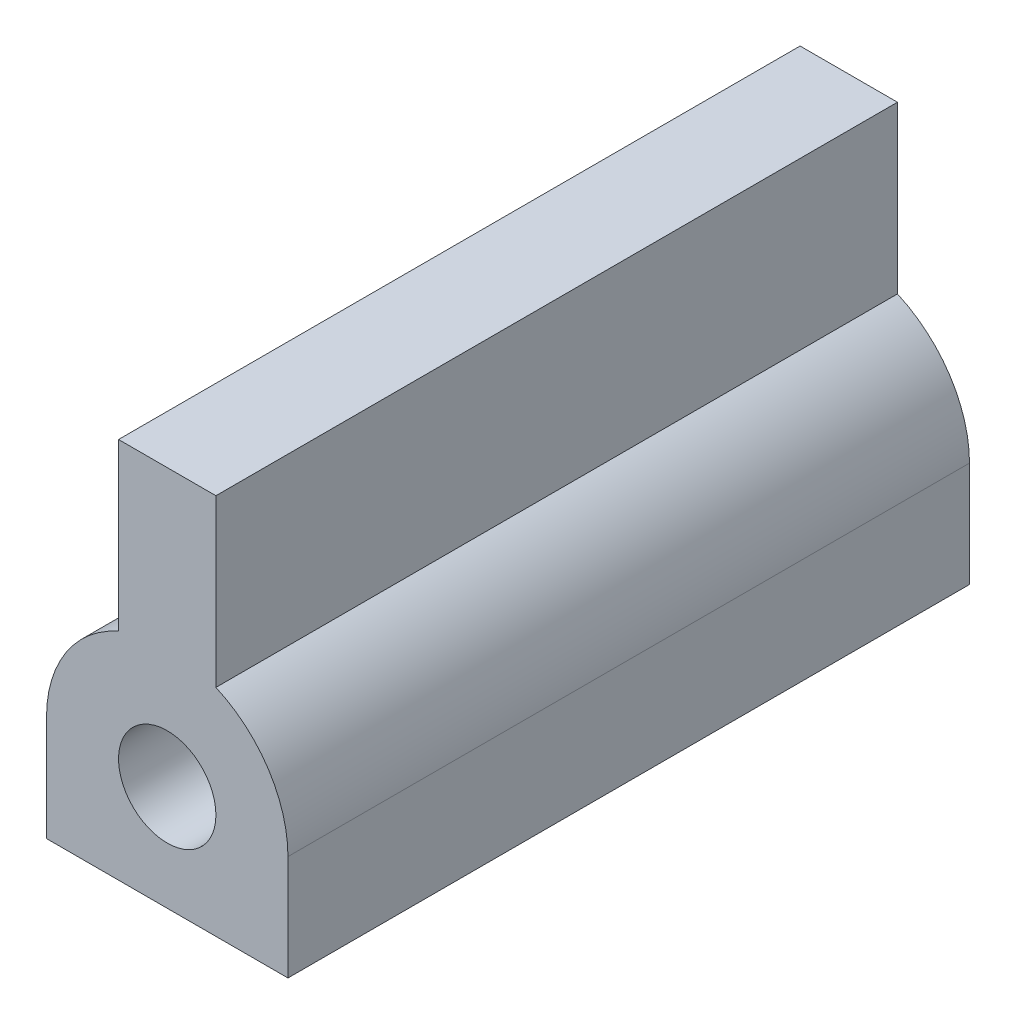
ISO-10303-21;
HEADER;
FILE_DESCRIPTION(('STEP AP214'),'2;1');
FILE_NAME('part.step','',(''),(''),'','','');
FILE_SCHEMA(('AUTOMOTIVE_DESIGN { 1 0 10303 214 1 1 1 1 }'));
ENDSEC;
DATA;
#1=APPLICATION_CONTEXT('core data for automotive mechanical design processes');
#2=APPLICATION_PROTOCOL_DEFINITION('international standard','automotive_design',2000,#1);
#3=PRODUCT_CONTEXT('',#1,'mechanical');
#4=PRODUCT('Part','Part','',(#3));
#5=PRODUCT_RELATED_PRODUCT_CATEGORY('part','',(#4));
#6=PRODUCT_DEFINITION_FORMATION('','',#4);
#7=PRODUCT_DEFINITION_CONTEXT('part definition',#1,'design');
#8=PRODUCT_DEFINITION('design','',#6,#7);
#9=PRODUCT_DEFINITION_SHAPE('','',#8);
#10=(LENGTH_UNIT() NAMED_UNIT(*) SI_UNIT(.MILLI.,.METRE.));
#11=(NAMED_UNIT(*) PLANE_ANGLE_UNIT() SI_UNIT($,.RADIAN.));
#12=(NAMED_UNIT(*) SI_UNIT($,.STERADIAN.) SOLID_ANGLE_UNIT());
#13=UNCERTAINTY_MEASURE_WITH_UNIT(LENGTH_MEASURE(1.E-05),#10,'distance_accuracy_value','');
#14=(GEOMETRIC_REPRESENTATION_CONTEXT(3) GLOBAL_UNCERTAINTY_ASSIGNED_CONTEXT((#13)) GLOBAL_UNIT_ASSIGNED_CONTEXT((#10,
#11,#12)) REPRESENTATION_CONTEXT('',''));
#15=CARTESIAN_POINT('',(0.,0.,0.));
#16=DIRECTION('',(0.,0.,1.));
#17=DIRECTION('',(1.,0.,0.));
#18=AXIS2_PLACEMENT_3D('',#15,#16,#17);
#19=CARTESIAN_POINT('',(0.,0.,22.225));
#20=DIRECTION('',(0.,0.,-1.));
#21=DIRECTION('',(-1.,0.,0.));
#22=AXIS2_PLACEMENT_3D('',#19,#20,#21);
#23=PLANE('',#22);
#24=DIRECTION('',(0.,-1.,0.));
#25=VECTOR('',#24,1.);
#26=CARTESIAN_POINT('',(-7.874,-6.858,22.225));
#27=LINE('',#26,#25);
#28=CARTESIAN_POINT('',(-7.874,0.,22.225));
#29=VERTEX_POINT('',#28);
#30=CARTESIAN_POINT('',(-7.874,-6.858,22.225));
#31=VERTEX_POINT('',#30);
#32=EDGE_CURVE('E164',#29,#31,#27,.T.);
#33=ORIENTED_EDGE('',*,*,#32,.T.);
#34=DIRECTION('',(1.,0.,0.));
#35=VECTOR('',#34,1.);
#36=CARTESIAN_POINT('',(7.874,-6.858,22.225));
#37=LINE('',#36,#35);
#38=CARTESIAN_POINT('',(7.874,-6.858,22.225));
#39=VERTEX_POINT('',#38);
#40=EDGE_CURVE('E100',#31,#39,#37,.T.);
#41=ORIENTED_EDGE('',*,*,#40,.T.);
#42=DIRECTION('',(0.,1.,0.));
#43=VECTOR('',#42,1.);
#44=CARTESIAN_POINT('',(7.874,0.,22.225));
#45=LINE('',#44,#43);
#46=CARTESIAN_POINT('',(7.874,0.,22.225));
#47=VERTEX_POINT('',#46);
#48=EDGE_CURVE('E185',#39,#47,#45,.T.);
#49=ORIENTED_EDGE('',*,*,#48,.T.);
#50=CARTESIAN_POINT('',(0.,0.,22.225));
#51=DIRECTION('',(0.,0.,1.));
#52=DIRECTION('',(-1.,0.,0.));
#53=AXIS2_PLACEMENT_3D('',#50,#51,#52);
#54=CIRCLE('',#53,7.874);
#55=CARTESIAN_POINT('',(3.175,7.20550143987217,22.225));
#56=VERTEX_POINT('',#55);
#57=EDGE_CURVE('E199',#47,#56,#54,.T.);
#58=ORIENTED_EDGE('',*,*,#57,.T.);
#59=DIRECTION('',(0.,1.,0.));
#60=VECTOR('',#59,1.);
#61=CARTESIAN_POINT('',(3.175,18.034,22.225));
#62=LINE('',#61,#60);
#63=CARTESIAN_POINT('',(3.175,18.034,22.225));
#64=VERTEX_POINT('',#63);
#65=EDGE_CURVE('E119',#56,#64,#62,.T.);
#66=ORIENTED_EDGE('',*,*,#65,.T.);
#67=DIRECTION('',(-1.,0.,0.));
#68=VECTOR('',#67,1.);
#69=CARTESIAN_POINT('',(-3.175,18.034,22.225));
#70=LINE('',#69,#68);
#71=CARTESIAN_POINT('',(-3.175,18.034,22.225));
#72=VERTEX_POINT('',#71);
#73=EDGE_CURVE('E113',#64,#72,#70,.T.);
#74=ORIENTED_EDGE('',*,*,#73,.T.);
#75=DIRECTION('',(0.,-1.,0.));
#76=VECTOR('',#75,1.);
#77=CARTESIAN_POINT('',(-3.175,7.20550143987217,22.225));
#78=LINE('',#77,#76);
#79=CARTESIAN_POINT('',(-3.175,7.20550143987217,22.225));
#80=VERTEX_POINT('',#79);
#81=EDGE_CURVE('E117',#72,#80,#78,.T.);
#82=ORIENTED_EDGE('',*,*,#81,.T.);
#83=CARTESIAN_POINT('',(0.,0.,22.225));
#84=DIRECTION('',(0.,0.,1.));
#85=DIRECTION('',(-1.,0.,0.));
#86=AXIS2_PLACEMENT_3D('',#83,#84,#85);
#87=CIRCLE('',#86,7.874);
#88=EDGE_CURVE('E57',#80,#29,#87,.T.);
#89=ORIENTED_EDGE('',*,*,#88,.T.);
#90=EDGE_LOOP('',(#33,#41,#49,#58,#66,#74,#82,#89));
#91=FACE_BOUND('',#90,.T.);
#92=CARTESIAN_POINT('',(0.,0.,22.225));
#93=DIRECTION('',(0.,0.,1.));
#94=DIRECTION('',(1.,0.,0.));
#95=AXIS2_PLACEMENT_3D('',#92,#93,#94);
#96=CIRCLE('',#95,3.175);
#97=CARTESIAN_POINT('',(3.175,0.,22.225));
#98=VERTEX_POINT('',#97);
#99=EDGE_CURVE('E146',#98,#98,#96,.T.);
#100=ORIENTED_EDGE('',*,*,#99,.F.);
#101=EDGE_LOOP('',(#100));
#102=FACE_BOUND('',#101,.T.);
#103=ADVANCED_FACE('F39',(#91,#102),#23,.F.);
#104=CARTESIAN_POINT('',(0.,0.,-22.225));
#105=DIRECTION('',(0.,0.,-1.));
#106=DIRECTION('',(-1.,0.,0.));
#107=AXIS2_PLACEMENT_3D('',#104,#105,#106);
#108=PLANE('',#107);
#109=DIRECTION('',(0.,-1.,0.));
#110=VECTOR('',#109,1.);
#111=CARTESIAN_POINT('',(-7.874,-6.858,-22.225));
#112=LINE('',#111,#110);
#113=CARTESIAN_POINT('',(-7.874,0.,-22.225));
#114=VERTEX_POINT('',#113);
#115=CARTESIAN_POINT('',(-7.874,-6.858,-22.225));
#116=VERTEX_POINT('',#115);
#117=EDGE_CURVE('E141',#114,#116,#112,.T.);
#118=ORIENTED_EDGE('',*,*,#117,.F.);
#119=CARTESIAN_POINT('',(0.,0.,-22.225));
#120=DIRECTION('',(0.,0.,1.));
#121=DIRECTION('',(-1.,0.,0.));
#122=AXIS2_PLACEMENT_3D('',#119,#120,#121);
#123=CIRCLE('',#122,7.874);
#124=CARTESIAN_POINT('',(-3.175,7.20550143987217,-22.225));
#125=VERTEX_POINT('',#124);
#126=EDGE_CURVE('E92',#125,#114,#123,.T.);
#127=ORIENTED_EDGE('',*,*,#126,.F.);
#128=DIRECTION('',(0.,-1.,0.));
#129=VECTOR('',#128,1.);
#130=CARTESIAN_POINT('',(-3.175,7.20550143987217,-22.225));
#131=LINE('',#130,#129);
#132=CARTESIAN_POINT('',(-3.175,18.034,-22.225));
#133=VERTEX_POINT('',#132);
#134=EDGE_CURVE('E86',#133,#125,#131,.T.);
#135=ORIENTED_EDGE('',*,*,#134,.F.);
#136=DIRECTION('',(-1.,0.,0.));
#137=VECTOR('',#136,1.);
#138=CARTESIAN_POINT('',(-3.175,18.034,-22.225));
#139=LINE('',#138,#137);
#140=CARTESIAN_POINT('',(3.175,18.034,-22.225));
#141=VERTEX_POINT('',#140);
#142=EDGE_CURVE('E128',#141,#133,#139,.T.);
#143=ORIENTED_EDGE('',*,*,#142,.F.);
#144=DIRECTION('',(0.,1.,0.));
#145=VECTOR('',#144,1.);
#146=CARTESIAN_POINT('',(3.175,18.034,-22.225));
#147=LINE('',#146,#145);
#148=CARTESIAN_POINT('',(3.175,7.20550143987217,-22.225));
#149=VERTEX_POINT('',#148);
#150=EDGE_CURVE('E155',#149,#141,#147,.T.);
#151=ORIENTED_EDGE('',*,*,#150,.F.);
#152=CARTESIAN_POINT('',(0.,0.,-22.225));
#153=DIRECTION('',(0.,0.,1.));
#154=DIRECTION('',(-1.,0.,0.));
#155=AXIS2_PLACEMENT_3D('',#152,#153,#154);
#156=CIRCLE('',#155,7.874);
#157=CARTESIAN_POINT('',(7.874,0.,-22.225));
#158=VERTEX_POINT('',#157);
#159=EDGE_CURVE('E152',#158,#149,#156,.T.);
#160=ORIENTED_EDGE('',*,*,#159,.F.);
#161=DIRECTION('',(0.,1.,0.));
#162=VECTOR('',#161,1.);
#163=CARTESIAN_POINT('',(7.874,0.,-22.225));
#164=LINE('',#163,#162);
#165=CARTESIAN_POINT('',(7.874,-6.858,-22.225));
#166=VERTEX_POINT('',#165);
#167=EDGE_CURVE('E149',#166,#158,#164,.T.);
#168=ORIENTED_EDGE('',*,*,#167,.F.);
#169=DIRECTION('',(1.,0.,0.));
#170=VECTOR('',#169,1.);
#171=CARTESIAN_POINT('',(7.874,-6.858,-22.225));
#172=LINE('',#171,#170);
#173=EDGE_CURVE('E145',#116,#166,#172,.T.);
#174=ORIENTED_EDGE('',*,*,#173,.F.);
#175=EDGE_LOOP('',(#118,#127,#135,#143,#151,#160,#168,#174));
#176=FACE_BOUND('',#175,.T.);
#177=CARTESIAN_POINT('',(0.,0.,-22.225));
#178=DIRECTION('',(0.,0.,1.));
#179=DIRECTION('',(1.,0.,0.));
#180=AXIS2_PLACEMENT_3D('',#177,#178,#179);
#181=CIRCLE('',#180,3.175);
#182=CARTESIAN_POINT('',(3.175,0.,-22.225));
#183=VERTEX_POINT('',#182);
#184=EDGE_CURVE('E209',#183,#183,#181,.T.);
#185=ORIENTED_EDGE('',*,*,#184,.T.);
#186=EDGE_LOOP('',(#185));
#187=FACE_BOUND('',#186,.T.);
#188=ADVANCED_FACE('F189',(#176,#187),#108,.T.);
#189=CARTESIAN_POINT('',(-7.874,-6.858,22.225));
#190=DIRECTION('',(1.,0.,0.));
#191=DIRECTION('',(0.,0.,-1.));
#192=AXIS2_PLACEMENT_3D('',#189,#190,#191);
#193=PLANE('',#192);
#194=ORIENTED_EDGE('',*,*,#117,.T.);
#195=DIRECTION('',(0.,0.,-1.));
#196=VECTOR('',#195,1.);
#197=CARTESIAN_POINT('',(-7.874,-6.858,22.225));
#198=LINE('',#197,#196);
#199=EDGE_CURVE('E11',#31,#116,#198,.T.);
#200=ORIENTED_EDGE('',*,*,#199,.F.);
#201=ORIENTED_EDGE('',*,*,#32,.F.);
#202=DIRECTION('',(0.,0.,-1.));
#203=VECTOR('',#202,1.);
#204=CARTESIAN_POINT('',(-7.874,0.,22.225));
#205=LINE('',#204,#203);
#206=EDGE_CURVE('E137',#29,#114,#205,.T.);
#207=ORIENTED_EDGE('',*,*,#206,.T.);
#208=EDGE_LOOP('',(#194,#200,#201,#207));
#209=FACE_BOUND('',#208,.T.);
#210=ADVANCED_FACE('F41',(#209),#193,.F.);
#211=CARTESIAN_POINT('',(7.874,-6.858,22.225));
#212=DIRECTION('',(0.,1.,0.));
#213=DIRECTION('',(-1.,0.,0.));
#214=AXIS2_PLACEMENT_3D('',#211,#212,#213);
#215=PLANE('',#214);
#216=ORIENTED_EDGE('',*,*,#173,.T.);
#217=DIRECTION('',(0.,0.,-1.));
#218=VECTOR('',#217,1.);
#219=CARTESIAN_POINT('',(7.874,-6.858,22.225));
#220=LINE('',#219,#218);
#221=EDGE_CURVE('E49',#39,#166,#220,.T.);
#222=ORIENTED_EDGE('',*,*,#221,.F.);
#223=ORIENTED_EDGE('',*,*,#40,.F.);
#224=ORIENTED_EDGE('',*,*,#199,.T.);
#225=EDGE_LOOP('',(#216,#222,#223,#224));
#226=FACE_BOUND('',#225,.T.);
#227=ADVANCED_FACE('F239',(#226),#215,.F.);
#228=CARTESIAN_POINT('',(7.874,0.,22.225));
#229=DIRECTION('',(-1.,0.,0.));
#230=DIRECTION('',(0.,0.,1.));
#231=AXIS2_PLACEMENT_3D('',#228,#229,#230);
#232=PLANE('',#231);
#233=ORIENTED_EDGE('',*,*,#167,.T.);
#234=DIRECTION('',(0.,0.,-1.));
#235=VECTOR('',#234,1.);
#236=CARTESIAN_POINT('',(7.874,0.,22.225));
#237=LINE('',#236,#235);
#238=EDGE_CURVE('E175',#47,#158,#237,.T.);
#239=ORIENTED_EDGE('',*,*,#238,.F.);
#240=ORIENTED_EDGE('',*,*,#48,.F.);
#241=ORIENTED_EDGE('',*,*,#221,.T.);
#242=EDGE_LOOP('',(#233,#239,#240,#241));
#243=FACE_BOUND('',#242,.T.);
#244=ADVANCED_FACE('F183',(#243),#232,.F.);
#245=CARTESIAN_POINT('',(0.,0.,22.225));
#246=DIRECTION('',(0.,0.,-1.));
#247=DIRECTION('',(-1.,0.,0.));
#248=AXIS2_PLACEMENT_3D('',#245,#246,#247);
#249=CYLINDRICAL_SURFACE('',#248,7.874);
#250=ORIENTED_EDGE('',*,*,#159,.T.);
#251=DIRECTION('',(0.,0.,-1.));
#252=VECTOR('',#251,1.);
#253=CARTESIAN_POINT('',(3.175,7.20550143987217,22.225));
#254=LINE('',#253,#252);
#255=EDGE_CURVE('E171',#56,#149,#254,.T.);
#256=ORIENTED_EDGE('',*,*,#255,.F.);
#257=ORIENTED_EDGE('',*,*,#57,.F.);
#258=ORIENTED_EDGE('',*,*,#238,.T.);
#259=EDGE_LOOP('',(#250,#256,#257,#258));
#260=FACE_BOUND('',#259,.T.);
#261=ADVANCED_FACE('F194',(#260),#249,.T.);
#262=CARTESIAN_POINT('',(3.175,18.034,22.225));
#263=DIRECTION('',(-1.,0.,0.));
#264=DIRECTION('',(0.,-1.,0.));
#265=AXIS2_PLACEMENT_3D('',#262,#263,#264);
#266=PLANE('',#265);
#267=ORIENTED_EDGE('',*,*,#150,.T.);
#268=DIRECTION('',(0.,0.,-1.));
#269=VECTOR('',#268,1.);
#270=CARTESIAN_POINT('',(3.175,18.034,22.225));
#271=LINE('',#270,#269);
#272=EDGE_CURVE('E130',#64,#141,#271,.T.);
#273=ORIENTED_EDGE('',*,*,#272,.F.);
#274=ORIENTED_EDGE('',*,*,#65,.F.);
#275=ORIENTED_EDGE('',*,*,#255,.T.);
#276=EDGE_LOOP('',(#267,#273,#274,#275));
#277=FACE_BOUND('',#276,.T.);
#278=ADVANCED_FACE('F197',(#277),#266,.F.);
#279=CARTESIAN_POINT('',(-3.175,18.034,22.225));
#280=DIRECTION('',(0.,-1.,0.));
#281=DIRECTION('',(0.,0.,-1.));
#282=AXIS2_PLACEMENT_3D('',#279,#280,#281);
#283=PLANE('',#282);
#284=ORIENTED_EDGE('',*,*,#142,.T.);
#285=DIRECTION('',(0.,0.,-1.));
#286=VECTOR('',#285,1.);
#287=CARTESIAN_POINT('',(-3.175,18.034,22.225));
#288=LINE('',#287,#286);
#289=EDGE_CURVE('E125',#72,#133,#288,.T.);
#290=ORIENTED_EDGE('',*,*,#289,.F.);
#291=ORIENTED_EDGE('',*,*,#73,.F.);
#292=ORIENTED_EDGE('',*,*,#272,.T.);
#293=EDGE_LOOP('',(#284,#290,#291,#292));
#294=FACE_BOUND('',#293,.T.);
#295=ADVANCED_FACE('F126',(#294),#283,.F.);
#296=CARTESIAN_POINT('',(-3.175,7.20550143987217,22.225));
#297=DIRECTION('',(1.,0.,0.));
#298=DIRECTION('',(0.,1.,0.));
#299=AXIS2_PLACEMENT_3D('',#296,#297,#298);
#300=PLANE('',#299);
#301=ORIENTED_EDGE('',*,*,#134,.T.);
#302=DIRECTION('',(0.,0.,-1.));
#303=VECTOR('',#302,1.);
#304=CARTESIAN_POINT('',(-3.175,7.20550143987217,22.225));
#305=LINE('',#304,#303);
#306=EDGE_CURVE('E131',#80,#125,#305,.T.);
#307=ORIENTED_EDGE('',*,*,#306,.F.);
#308=ORIENTED_EDGE('',*,*,#81,.F.);
#309=ORIENTED_EDGE('',*,*,#289,.T.);
#310=EDGE_LOOP('',(#301,#307,#308,#309));
#311=FACE_BOUND('',#310,.T.);
#312=ADVANCED_FACE('F133',(#311),#300,.F.);
#313=CARTESIAN_POINT('',(0.,0.,22.225));
#314=DIRECTION('',(0.,0.,-1.));
#315=DIRECTION('',(-1.,0.,0.));
#316=AXIS2_PLACEMENT_3D('',#313,#314,#315);
#317=CYLINDRICAL_SURFACE('',#316,7.874);
#318=ORIENTED_EDGE('',*,*,#126,.T.);
#319=ORIENTED_EDGE('',*,*,#206,.F.);
#320=ORIENTED_EDGE('',*,*,#88,.F.);
#321=ORIENTED_EDGE('',*,*,#306,.T.);
#322=EDGE_LOOP('',(#318,#319,#320,#321));
#323=FACE_BOUND('',#322,.T.);
#324=ADVANCED_FACE('F227',(#323),#317,.T.);
#325=CARTESIAN_POINT('',(0.,0.,22.225));
#326=DIRECTION('',(0.,0.,-1.));
#327=DIRECTION('',(-1.,0.,0.));
#328=AXIS2_PLACEMENT_3D('',#325,#326,#327);
#329=CYLINDRICAL_SURFACE('',#328,3.175);
#330=ORIENTED_EDGE('',*,*,#99,.T.);
#331=EDGE_LOOP('',(#330));
#332=FACE_BOUND('',#331,.T.);
#333=ORIENTED_EDGE('',*,*,#184,.F.);
#334=EDGE_LOOP('',(#333));
#335=FACE_BOUND('',#334,.T.);
#336=ADVANCED_FACE('F217',(#332,#335),#329,.F.);
#337=CLOSED_SHELL('',(#103,#188,#210,#227,#244,#261,#278,#295,#312,#324,#336));
#338=MANIFOLD_SOLID_BREP('B2',#337);
#339=ADVANCED_BREP_SHAPE_REPRESENTATION('',(#18,#338),#14);
#340=SHAPE_DEFINITION_REPRESENTATION(#9,#339);
ENDSEC;
END-ISO-10303-21;
